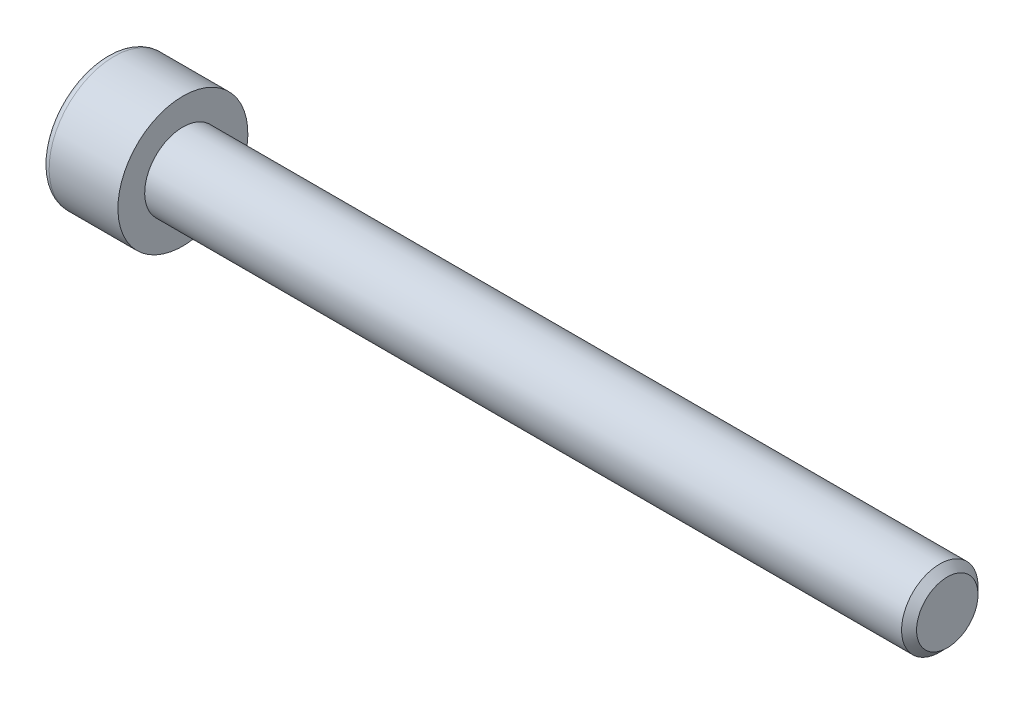
ISO-10303-21;
HEADER;
FILE_DESCRIPTION(('STEP AP214'),'2;1');
FILE_NAME('part.step','',(''),(''),'','','');
FILE_SCHEMA(('AUTOMOTIVE_DESIGN { 1 0 10303 214 1 1 1 1 }'));
ENDSEC;
DATA;
#1=APPLICATION_CONTEXT('core data for automotive mechanical design processes');
#2=APPLICATION_PROTOCOL_DEFINITION('international standard','automotive_design',2000,#1);
#3=PRODUCT_CONTEXT('',#1,'mechanical');
#4=PRODUCT('Part','Part','',(#3));
#5=PRODUCT_RELATED_PRODUCT_CATEGORY('part','',(#4));
#6=PRODUCT_DEFINITION_FORMATION('','',#4);
#7=PRODUCT_DEFINITION_CONTEXT('part definition',#1,'design');
#8=PRODUCT_DEFINITION('design','',#6,#7);
#9=PRODUCT_DEFINITION_SHAPE('','',#8);
#10=(LENGTH_UNIT() NAMED_UNIT(*) SI_UNIT(.MILLI.,.METRE.));
#11=(NAMED_UNIT(*) PLANE_ANGLE_UNIT() SI_UNIT($,.RADIAN.));
#12=(NAMED_UNIT(*) SI_UNIT($,.STERADIAN.) SOLID_ANGLE_UNIT());
#13=UNCERTAINTY_MEASURE_WITH_UNIT(LENGTH_MEASURE(1.E-05),#10,'distance_accuracy_value','');
#14=(GEOMETRIC_REPRESENTATION_CONTEXT(3) GLOBAL_UNCERTAINTY_ASSIGNED_CONTEXT((#13)) GLOBAL_UNIT_ASSIGNED_CONTEXT((#10,
#11,#12)) REPRESENTATION_CONTEXT('',''));
#15=CARTESIAN_POINT('',(0.,0.,0.));
#16=DIRECTION('',(0.,0.,1.));
#17=DIRECTION('',(1.,0.,0.));
#18=AXIS2_PLACEMENT_3D('',#15,#16,#17);
#19=CARTESIAN_POINT('',(-1.16666666667697,0.,0.));
#20=DIRECTION('',(-1.,0.,0.));
#21=DIRECTION('',(0.,0.,1.));
#22=AXIS2_PLACEMENT_3D('',#19,#20,#21);
#23=CONICAL_SURFACE('',#22,0.,1.04719755119019);
#24=CARTESIAN_POINT('',(-1.16666666667697,0.,0.));
#25=VERTEX_POINT('',#24);
#26=VERTEX_LOOP('',#25);
#27=FACE_BOUND('',#26,.T.);
#28=CARTESIAN_POINT('',(-2.50000000002772,-6.92690109786421E-12,-2.30940107675451));
#29=CARTESIAN_POINT('',(-2.47069554515409,-0.0878878875699675,-2.25865898121148));
#30=CARTESIAN_POINT('',(-2.44404467712742,-0.176534422128159,-2.20747888062158));
#31=CARTESIAN_POINT('',(-2.39752638742714,-0.355362346693125,-2.10423253023537));
#32=CARTESIAN_POINT('',(-2.37767542036486,-0.445546913091718,-2.05216444654839));
#33=CARTESIAN_POINT('',(-2.34677595897283,-0.624798433766054,-1.94867353283442));
#34=CARTESIAN_POINT('',(-2.33552178762371,-0.713837815623628,-1.89726662175047));
#35=CARTESIAN_POINT('',(-2.32208916815753,-0.892335320469239,-1.79421103927818));
#36=CARTESIAN_POINT('',(-2.3198995940015,-0.981792795112552,-1.74256274221184));
#37=CARTESIAN_POINT('',(-2.32446629018259,-1.14893448971583,-1.64606343983982));
#38=CARTESIAN_POINT('',(-2.33010128524422,-1.22664379064875,-1.60119795402767));
#39=CARTESIAN_POINT('',(-2.34795730074633,-1.38155614176728,-1.51175926640858));
#40=CARTESIAN_POINT('',(-2.36018441479689,-1.45875865655235,-1.46718637371531));
#41=CARTESIAN_POINT('',(-2.39074983336655,-1.61399014172354,-1.37756343396501));
#42=CARTESIAN_POINT('',(-2.40921764224648,-1.69199947538136,-1.33252472417837));
#43=CARTESIAN_POINT('',(-2.45113176086735,-1.84685497000033,-1.24311886267461));
#44=CARTESIAN_POINT('',(-2.47456822878008,-1.92370311330898,-1.19875056644864));
#45=CARTESIAN_POINT('',(-2.50000000002772,-1.99999999999307,-1.15470053838325));
#46=B_SPLINE_CURVE_WITH_KNOTS('',3,(#28,#29,#30,#31,#32,#33,#34,#35,#36,#37,#38,#39,#40,#41,#42,
#43,#44,#45),.UNSPECIFIED.,.F.,.F.,(4,2,2,2,2,2,2,2,4),(0.,0.317016011557088,0.634793817027589,
0.944707606153461,1.25424088889841,1.52370778262845,1.79342419378692,2.06912162247711,
2.34427797349934),.UNSPECIFIED.);
#47=CARTESIAN_POINT('',(-2.50000000002772,0.,-2.30940107675451));
#48=VERTEX_POINT('',#47);
#49=CARTESIAN_POINT('',(-2.50000000002772,-1.99999999999654,-1.15470053837725));
#50=VERTEX_POINT('',#49);
#51=EDGE_CURVE('E138',#48,#50,#46,.T.);
#52=ORIENTED_EDGE('',*,*,#51,.T.);
#53=CARTESIAN_POINT('',(-2.50000000002772,-2.,-1.15470053837125));
#54=CARTESIAN_POINT('',(-2.47263377290747,-2.,-1.05991107418636));
#55=CARTESIAN_POINT('',(-2.44757921995705,-2.,-0.964371741189674));
#56=CARTESIAN_POINT('',(-2.40329840636778,-2.,-0.771741104892955));
#57=CARTESIAN_POINT('',(-2.38408518617665,-2.,-0.674646831223166));
#58=CARTESIAN_POINT('',(-2.35318800206326,-2.,-0.481547768443135));
#59=CARTESIAN_POINT('',(-2.34133930729348,-2.,-0.385570166139693));
#60=CARTESIAN_POINT('',(-2.32543313734544,-2.,-0.193061232217813));
#61=CARTESIAN_POINT('',(-2.32136720507473,-2.,-0.0965306161072731));
#62=CARTESIAN_POINT('',(-2.32136720507188,-2.,0.0965306087795346));
#63=CARTESIAN_POINT('',(-2.32543313672243,-2.,0.193061217555803));
#64=CARTESIAN_POINT('',(-2.34133930429026,-2.,0.385570136931378));
#65=CARTESIAN_POINT('',(-2.35318799729708,-2.,0.481547732023092));
#66=CARTESIAN_POINT('',(-2.38408517693299,-2.,0.674646780255356));
#67=CARTESIAN_POINT('',(-2.40329839437538,-2.,0.771741046596714));
#68=CARTESIAN_POINT('',(-2.44757920184622,-2.,0.964371668527462));
#69=CARTESIAN_POINT('',(-2.47263375143113,-2.,1.05991099448547));
#70=CARTESIAN_POINT('',(-2.4999999750194,-2.,1.15470045173988));
#71=B_SPLINE_CURVE_WITH_KNOTS('',3,(#53,#54,#55,#56,#57,#58,#59,#60,#61,#62,#63,#64,#65,#66,#67,
#68,#69,#70),.UNSPECIFIED.,.F.,.F.,(4,2,2,2,2,2,2,2,4),(0.,0.296073395837264,0.592802985914095,
0.882630859073849,1.17214361331652,1.46165634558198,1.75148419667861,2.04821376361903,
2.34428713651065),.UNSPECIFIED.);
#72=CARTESIAN_POINT('',(-2.49999999233435,-2.00000001442891,1.15470048672903));
#73=VERTEX_POINT('',#72);
#74=EDGE_CURVE('E320',#50,#73,#71,.T.);
#75=ORIENTED_EDGE('',*,*,#74,.T.);
#76=CARTESIAN_POINT('',(-2.50000003231498,-2.00000000443896,1.15470049250949));
#77=CARTESIAN_POINT('',(-2.47069556141285,-1.91211212986852,1.20544260830426));
#78=CARTESIAN_POINT('',(-2.4440446860581,-1.82346559924677,1.25662271800665));
#79=CARTESIAN_POINT('',(-2.39752638961972,-1.64463767471672,1.35986907672013));
#80=CARTESIAN_POINT('',(-2.3776754231514,-1.55445310440017,1.41193715959666));
#81=CARTESIAN_POINT('',(-2.34677596129522,-1.37520157840778,1.51542807419591));
#82=CARTESIAN_POINT('',(-2.33552178889736,-1.28616219510353,1.56683498690637));
#83=CARTESIAN_POINT('',(-2.32208916823046,-1.10766468668214,1.66989057201796));
#84=CARTESIAN_POINT('',(-2.31989959392978,-1.01820720990997,1.72153887009819));
#85=CARTESIAN_POINT('',(-2.32446629004929,-0.851065513068019,1.81803817362797));
#86=CARTESIAN_POINT('',(-2.33010128501756,-0.773356212002576,1.86290365956245));
#87=CARTESIAN_POINT('',(-2.34795730039037,-0.61844386063507,1.95234234735909));
#88=CARTESIAN_POINT('',(-2.36018441440079,-0.541241345733143,1.9969152401078));
#89=CARTESIAN_POINT('',(-2.39074983295,-0.386009860111517,2.08653818010828));
#90=CARTESIAN_POINT('',(-2.40921764186712,-0.308000526122906,2.13157689008841));
#91=CARTESIAN_POINT('',(-2.4511317606282,-0.153145030780701,2.2209827520147));
#92=CARTESIAN_POINT('',(-2.47456822864842,-0.076296887080505,2.26535104846921));
#93=CARTESIAN_POINT('',(-2.50000000002772,-6.92562731338522E-12,2.3094010767545));
#94=B_SPLINE_CURVE_WITH_KNOTS('',3,(#76,#77,#78,#79,#80,#81,#82,#83,#84,#85,#86,#87,#88,#89,#90,
#91,#92,#93),.UNSPECIFIED.,.F.,.F.,(4,2,2,2,2,2,2,2,4),(0.,0.317016020366453,0.634793833974186,
0.944707629768868,1.25424091946273,1.5237078137243,1.79342422524043,2.06912165507871,
2.34427800749697),.UNSPECIFIED.);
#95=CARTESIAN_POINT('',(-2.50000000002772,0.,2.3094010767545));
#96=VERTEX_POINT('',#95);
#97=EDGE_CURVE('E336',#73,#96,#94,.T.);
#98=ORIENTED_EDGE('',*,*,#97,.T.);
#99=CARTESIAN_POINT('',(-2.50000000002772,6.92566095216022E-12,2.3094010767545));
#100=CARTESIAN_POINT('',(-2.47069554515409,0.0878878875699661,2.25865898121148));
#101=CARTESIAN_POINT('',(-2.44404467712742,0.176534422128157,2.20747888062158));
#102=CARTESIAN_POINT('',(-2.39752638742714,0.355362346693123,2.10423253023537));
#103=CARTESIAN_POINT('',(-2.37767542036486,0.445546913091717,2.05216444654839));
#104=CARTESIAN_POINT('',(-2.34677595897283,0.624798433766052,1.94867353283442));
#105=CARTESIAN_POINT('',(-2.33552178762371,0.713837815623626,1.89726662175047));
#106=CARTESIAN_POINT('',(-2.32208916815753,0.892335320469238,1.79421103927818));
#107=CARTESIAN_POINT('',(-2.3198995940015,0.98179279511255,1.74256274221184));
#108=CARTESIAN_POINT('',(-2.32446629018259,1.14893448971583,1.64606343983982));
#109=CARTESIAN_POINT('',(-2.33010128524422,1.22664379064875,1.60119795402767));
#110=CARTESIAN_POINT('',(-2.34795730074633,1.38155614176728,1.51175926640858));
#111=CARTESIAN_POINT('',(-2.36018441479689,1.45875865655235,1.46718637371531));
#112=CARTESIAN_POINT('',(-2.39074983336655,1.61399014172354,1.37756343396501));
#113=CARTESIAN_POINT('',(-2.40921764224648,1.69199947538136,1.33252472417837));
#114=CARTESIAN_POINT('',(-2.45113176086735,1.84685497000033,1.24311886267461));
#115=CARTESIAN_POINT('',(-2.47456822878008,1.92370311330899,1.19875056644864));
#116=CARTESIAN_POINT('',(-2.50000000002772,1.99999999999308,1.15470053838325));
#117=B_SPLINE_CURVE_WITH_KNOTS('',3,(#99,#100,#101,#102,#103,#104,#105,#106,#107,#108,#109,#110,
#111,#112,#113,#114,#115,#116),.UNSPECIFIED.,.F.,.F.,(4,2,2,2,2,2,2,2,4),(0.,0.317016011557087,
0.634793817027588,0.94470760615346,1.25424088889841,1.52370778262845,1.79342419378692,
2.06912162247711,2.34427797349934),.UNSPECIFIED.);
#118=CARTESIAN_POINT('',(-2.50000000002772,1.99999999999654,1.15470053837725));
#119=VERTEX_POINT('',#118);
#120=EDGE_CURVE('E341',#96,#119,#117,.T.);
#121=ORIENTED_EDGE('',*,*,#120,.T.);
#122=CARTESIAN_POINT('',(-2.50000000002772,2.,1.15470053837125));
#123=CARTESIAN_POINT('',(-2.47263377290036,2.,1.05991107416127));
#124=CARTESIAN_POINT('',(-2.44757921994389,2.,0.964371741139248));
#125=CARTESIAN_POINT('',(-2.40329840634492,2.,0.771741104786663));
#126=CARTESIAN_POINT('',(-2.38408518615041,2.,0.674646831086282));
#127=CARTESIAN_POINT('',(-2.35318800204471,2.,0.481547768300791));
#128=CARTESIAN_POINT('',(-2.34133930728186,2.,0.385570166023165));
#129=CARTESIAN_POINT('',(-2.32543313734251,2.,0.193061232158415));
#130=CARTESIAN_POINT('',(-2.32136720507331,2.,0.0965306160792071));
#131=CARTESIAN_POINT('',(-2.32136720507331,2.,-0.0965306160792082));
#132=CARTESIAN_POINT('',(-2.32543313734251,2.,-0.193061232158416));
#133=CARTESIAN_POINT('',(-2.34133930728186,2.,-0.385570166023167));
#134=CARTESIAN_POINT('',(-2.35318800204471,2.,-0.481547768300793));
#135=CARTESIAN_POINT('',(-2.38408518615041,2.,-0.674646831086284));
#136=CARTESIAN_POINT('',(-2.40329840634492,2.,-0.771741104786666));
#137=CARTESIAN_POINT('',(-2.44757921994389,2.,-0.964371741139251));
#138=CARTESIAN_POINT('',(-2.47263377290036,2.,-1.05991107416128));
#139=CARTESIAN_POINT('',(-2.50000000002772,2.,-1.15470053837126));
#140=B_SPLINE_CURVE_WITH_KNOTS('',3,(#122,#123,#124,#125,#126,#127,#128,#129,#130,#131,#132,
#133,#134,#135,#136,#137,#138,#139),.UNSPECIFIED.,.F.,.F.,(4,2,2,2,2,2,2,2,4),(0.,
0.296073395915318,0.592802986084094,0.882630859163671,1.17214361331655,1.46165636746943,
1.75148424054901,2.04821383071779,2.3442872266331),.UNSPECIFIED.);
#141=CARTESIAN_POINT('',(-2.50000000002888,2.,-1.15470053837525));
#142=VERTEX_POINT('',#141);
#143=EDGE_CURVE('E21',#119,#142,#140,.T.);
#144=ORIENTED_EDGE('',*,*,#143,.T.);
#145=CARTESIAN_POINT('',(-2.50000000002772,1.99999999999307,-1.15470053838325));
#146=CARTESIAN_POINT('',(-2.47069554515409,1.91211211243003,-1.20544263392628));
#147=CARTESIAN_POINT('',(-2.44404467712742,1.82346557787184,-1.25662273451618));
#148=CARTESIAN_POINT('',(-2.39752638742714,1.64463765330688,-1.35986908490239));
#149=CARTESIAN_POINT('',(-2.37767542036486,1.55445308690828,-1.41193716858936));
#150=CARTESIAN_POINT('',(-2.34677595897283,1.37520156623395,-1.51542808230334));
#151=CARTESIAN_POINT('',(-2.33552178762371,1.28616218437637,-1.56683499338729));
#152=CARTESIAN_POINT('',(-2.32208916815753,1.10766467953076,-1.66989057585958));
#153=CARTESIAN_POINT('',(-2.3198995940015,1.01820720488745,-1.72153887292592));
#154=CARTESIAN_POINT('',(-2.32446629018259,0.851065510284168,-1.81803817529793));
#155=CARTESIAN_POINT('',(-2.33010128524422,0.773356209351252,-1.86290366111009));
#156=CARTESIAN_POINT('',(-2.34795730074633,0.618443858232721,-1.95234234872917));
#157=CARTESIAN_POINT('',(-2.36018441479689,0.541241343447649,-1.99691524142245));
#158=CARTESIAN_POINT('',(-2.39074983336655,0.386009858276457,-2.08653818117274));
#159=CARTESIAN_POINT('',(-2.40921764224648,0.308000524618637,-2.13157689095939));
#160=CARTESIAN_POINT('',(-2.45113176086735,0.153145029999667,-2.22098275246314));
#161=CARTESIAN_POINT('',(-2.47456822878008,0.0762968866910162,-2.26535104868912));
#162=CARTESIAN_POINT('',(-2.50000000002772,6.92553144990538E-12,-2.30940107675451));
#163=B_SPLINE_CURVE_WITH_KNOTS('',3,(#145,#146,#147,#148,#149,#150,#151,#152,#153,#154,#155,
#156,#157,#158,#159,#160,#161,#162),.UNSPECIFIED.,.F.,.F.,(4,2,2,2,2,2,2,2,4),(0.,
0.317016011557087,0.634793817027589,0.94470760615346,1.25424088889841,1.52370778262845,
1.79342419378692,2.06912162247711,2.34427797349934),.UNSPECIFIED.);
#164=EDGE_CURVE('E91',#142,#48,#163,.T.);
#165=ORIENTED_EDGE('',*,*,#164,.T.);
#166=EDGE_LOOP('',(#52,#75,#98,#121,#144,#165));
#167=FACE_BOUND('',#166,.T.);
#168=ADVANCED_FACE('F17',(#27,#167),#23,.F.);
#169=CARTESIAN_POINT('',(-5.,2.,1.15470053837925));
#170=DIRECTION('',(0.,1.,0.));
#171=DIRECTION('',(0.,0.,1.));
#172=AXIS2_PLACEMENT_3D('',#169,#170,#171);
#173=PLANE('',#172);
#174=DIRECTION('',(1.,0.,0.));
#175=VECTOR('',#174,1.);
#176=CARTESIAN_POINT('',(-5.,2.,1.15470053837925));
#177=LINE('',#176,#175);
#178=CARTESIAN_POINT('',(-5.,2.,1.15470053837925));
#179=VERTEX_POINT('',#178);
#180=EDGE_CURVE('E85',#119,#179,#177,.F.);
#181=ORIENTED_EDGE('',*,*,#180,.T.);
#182=DIRECTION('',(0.,0.,1.));
#183=VECTOR('',#182,1.);
#184=CARTESIAN_POINT('',(-5.,2.,0.));
#185=LINE('',#184,#183);
#186=CARTESIAN_POINT('',(-5.,2.,-1.15470053837925));
#187=VERTEX_POINT('',#186);
#188=EDGE_CURVE('E79',#187,#179,#185,.T.);
#189=ORIENTED_EDGE('',*,*,#188,.F.);
#190=DIRECTION('',(1.,0.,0.));
#191=VECTOR('',#190,1.);
#192=CARTESIAN_POINT('',(-5.,2.,-1.15470053837925));
#193=LINE('',#192,#191);
#194=EDGE_CURVE('E82',#187,#142,#193,.T.);
#195=ORIENTED_EDGE('',*,*,#194,.T.);
#196=ORIENTED_EDGE('',*,*,#143,.F.);
#197=EDGE_LOOP('',(#181,#189,#195,#196));
#198=FACE_BOUND('',#197,.T.);
#199=ADVANCED_FACE('F81',(#198),#173,.F.);
#200=CARTESIAN_POINT('',(-5.,0.,2.3094010767585));
#201=DIRECTION('',(0.,0.5,0.866025403784438));
#202=DIRECTION('',(0.,-0.866025403784438,0.5));
#203=AXIS2_PLACEMENT_3D('',#200,#201,#202);
#204=PLANE('',#203);
#205=DIRECTION('',(1.,0.,0.));
#206=VECTOR('',#205,1.);
#207=CARTESIAN_POINT('',(-5.,0.,2.3094010767585));
#208=LINE('',#207,#206);
#209=CARTESIAN_POINT('',(-5.,0.,2.3094010767585));
#210=VERTEX_POINT('',#209);
#211=EDGE_CURVE('E339',#96,#210,#208,.F.);
#212=ORIENTED_EDGE('',*,*,#211,.T.);
#213=DIRECTION('',(0.,-0.866025403784438,0.5));
#214=VECTOR('',#213,1.);
#215=CARTESIAN_POINT('',(-5.,2.,1.15470053837925));
#216=LINE('',#215,#214);
#217=EDGE_CURVE('E90',#179,#210,#216,.T.);
#218=ORIENTED_EDGE('',*,*,#217,.F.);
#219=ORIENTED_EDGE('',*,*,#180,.F.);
#220=ORIENTED_EDGE('',*,*,#120,.F.);
#221=EDGE_LOOP('',(#212,#218,#219,#220));
#222=FACE_BOUND('',#221,.T.);
#223=ADVANCED_FACE('F284',(#222),#204,.F.);
#224=CARTESIAN_POINT('',(-5.,-2.,1.15470053837925));
#225=DIRECTION('',(0.,-0.5,0.866025403784439));
#226=DIRECTION('',(0.,-0.866025403784439,-0.5));
#227=AXIS2_PLACEMENT_3D('',#224,#225,#226);
#228=PLANE('',#227);
#229=DIRECTION('',(1.,0.,0.));
#230=VECTOR('',#229,1.);
#231=CARTESIAN_POINT('',(-5.,-2.,1.15470053837925));
#232=LINE('',#231,#230);
#233=CARTESIAN_POINT('',(-5.,-2.,1.15470053837925));
#234=VERTEX_POINT('',#233);
#235=EDGE_CURVE('E325',#73,#234,#232,.F.);
#236=ORIENTED_EDGE('',*,*,#235,.T.);
#237=DIRECTION('',(0.,-0.866025403784439,-0.5));
#238=VECTOR('',#237,1.);
#239=CARTESIAN_POINT('',(-5.,0.,2.3094010767585));
#240=LINE('',#239,#238);
#241=EDGE_CURVE('E115',#210,#234,#240,.T.);
#242=ORIENTED_EDGE('',*,*,#241,.F.);
#243=ORIENTED_EDGE('',*,*,#211,.F.);
#244=ORIENTED_EDGE('',*,*,#97,.F.);
#245=EDGE_LOOP('',(#236,#242,#243,#244));
#246=FACE_BOUND('',#245,.T.);
#247=ADVANCED_FACE('F276',(#246),#228,.F.);
#248=CARTESIAN_POINT('',(-5.,-2.,-1.15470053837925));
#249=DIRECTION('',(0.,-1.,0.));
#250=DIRECTION('',(0.,0.,-1.));
#251=AXIS2_PLACEMENT_3D('',#248,#249,#250);
#252=PLANE('',#251);
#253=DIRECTION('',(1.,0.,0.));
#254=VECTOR('',#253,1.);
#255=CARTESIAN_POINT('',(-5.,-2.,-1.15470053837925));
#256=LINE('',#255,#254);
#257=CARTESIAN_POINT('',(-5.,-2.,-1.15470053837925));
#258=VERTEX_POINT('',#257);
#259=EDGE_CURVE('E322',#50,#258,#256,.F.);
#260=ORIENTED_EDGE('',*,*,#259,.T.);
#261=DIRECTION('',(0.,0.,1.));
#262=VECTOR('',#261,1.);
#263=CARTESIAN_POINT('',(-5.,-2.,0.));
#264=LINE('',#263,#262);
#265=EDGE_CURVE('E105',#234,#258,#264,.F.);
#266=ORIENTED_EDGE('',*,*,#265,.F.);
#267=ORIENTED_EDGE('',*,*,#235,.F.);
#268=ORIENTED_EDGE('',*,*,#74,.F.);
#269=EDGE_LOOP('',(#260,#266,#267,#268));
#270=FACE_BOUND('',#269,.T.);
#271=ADVANCED_FACE('F269',(#270),#252,.F.);
#272=CARTESIAN_POINT('',(-5.,0.,-2.3094010767585));
#273=DIRECTION('',(0.,-0.5,-0.866025403784438));
#274=DIRECTION('',(0.,0.866025403784438,-0.5));
#275=AXIS2_PLACEMENT_3D('',#272,#273,#274);
#276=PLANE('',#275);
#277=DIRECTION('',(1.,0.,0.));
#278=VECTOR('',#277,1.);
#279=CARTESIAN_POINT('',(-5.,0.,-2.3094010767585));
#280=LINE('',#279,#278);
#281=CARTESIAN_POINT('',(-5.,0.,-2.3094010767585));
#282=VERTEX_POINT('',#281);
#283=EDGE_CURVE('E41',#48,#282,#280,.F.);
#284=ORIENTED_EDGE('',*,*,#283,.T.);
#285=DIRECTION('',(0.,0.866025403784438,-0.500000000000001));
#286=VECTOR('',#285,1.);
#287=CARTESIAN_POINT('',(-5.,-2.,-1.15470053837925));
#288=LINE('',#287,#286);
#289=EDGE_CURVE('E100',#258,#282,#288,.T.);
#290=ORIENTED_EDGE('',*,*,#289,.F.);
#291=ORIENTED_EDGE('',*,*,#259,.F.);
#292=ORIENTED_EDGE('',*,*,#51,.F.);
#293=EDGE_LOOP('',(#284,#290,#291,#292));
#294=FACE_BOUND('',#293,.T.);
#295=ADVANCED_FACE('F148',(#294),#276,.F.);
#296=CARTESIAN_POINT('',(-5.,2.,-1.15470053837925));
#297=DIRECTION('',(0.,0.5,-0.866025403784439));
#298=DIRECTION('',(0.,0.866025403784439,0.5));
#299=AXIS2_PLACEMENT_3D('',#296,#297,#298);
#300=PLANE('',#299);
#301=ORIENTED_EDGE('',*,*,#194,.F.);
#302=DIRECTION('',(0.,0.866025403784439,0.5));
#303=VECTOR('',#302,1.);
#304=CARTESIAN_POINT('',(-5.,0.,-2.3094010767585));
#305=LINE('',#304,#303);
#306=EDGE_CURVE('E95',#282,#187,#305,.T.);
#307=ORIENTED_EDGE('',*,*,#306,.F.);
#308=ORIENTED_EDGE('',*,*,#283,.F.);
#309=ORIENTED_EDGE('',*,*,#164,.F.);
#310=EDGE_LOOP('',(#301,#307,#308,#309));
#311=FACE_BOUND('',#310,.T.);
#312=ADVANCED_FACE('F94',(#311),#300,.F.);
#313=CARTESIAN_POINT('',(-5.,3.27970053837925,0.));
#314=DIRECTION('',(-1.,0.,0.));
#315=DIRECTION('',(0.,-1.,0.));
#316=AXIS2_PLACEMENT_3D('',#313,#314,#315);
#317=PLANE('',#316);
#318=CARTESIAN_POINT('',(-5.,0.,0.));
#319=DIRECTION('',(1.,0.,0.));
#320=DIRECTION('',(0.,1.,0.));
#321=AXIS2_PLACEMENT_3D('',#318,#319,#320);
#322=CIRCLE('',#321,3.75);
#323=CARTESIAN_POINT('',(-5.,3.75,0.));
#324=VERTEX_POINT('',#323);
#325=EDGE_CURVE('E101',#324,#324,#322,.T.);
#326=ORIENTED_EDGE('',*,*,#325,.F.);
#327=EDGE_LOOP('',(#326));
#328=FACE_BOUND('',#327,.T.);
#329=ORIENTED_EDGE('',*,*,#289,.T.);
#330=ORIENTED_EDGE('',*,*,#306,.T.);
#331=ORIENTED_EDGE('',*,*,#188,.T.);
#332=ORIENTED_EDGE('',*,*,#217,.T.);
#333=ORIENTED_EDGE('',*,*,#241,.T.);
#334=ORIENTED_EDGE('',*,*,#265,.T.);
#335=EDGE_LOOP('',(#329,#330,#331,#332,#333,#334));
#336=FACE_BOUND('',#335,.T.);
#337=ADVANCED_FACE('F98',(#328,#336),#317,.T.);
#338=CARTESIAN_POINT('',(-4.5,0.,0.));
#339=DIRECTION('',(1.,0.,0.));
#340=DIRECTION('',(0.,0.,-1.));
#341=AXIS2_PLACEMENT_3D('',#338,#339,#340);
#342=TOROIDAL_SURFACE('',#341,3.75,0.5);
#343=CARTESIAN_POINT('',(-4.5,0.,0.));
#344=DIRECTION('',(1.,0.,0.));
#345=DIRECTION('',(0.,1.,0.));
#346=AXIS2_PLACEMENT_3D('',#343,#344,#345);
#347=CIRCLE('',#346,4.25);
#348=CARTESIAN_POINT('',(-4.5,4.25,0.));
#349=VERTEX_POINT('',#348);
#350=EDGE_CURVE('E104',#349,#349,#347,.T.);
#351=ORIENTED_EDGE('',*,*,#350,.F.);
#352=EDGE_LOOP('',(#351));
#353=FACE_BOUND('',#352,.T.);
#354=ORIENTED_EDGE('',*,*,#325,.T.);
#355=EDGE_LOOP('',(#354));
#356=FACE_BOUND('',#355,.T.);
#357=ADVANCED_FACE('F154',(#353,#356),#342,.T.);
#358=CARTESIAN_POINT('',(-2.5,0.,0.));
#359=DIRECTION('',(1.,0.,0.));
#360=DIRECTION('',(0.,1.,0.));
#361=AXIS2_PLACEMENT_3D('',#358,#359,#360);
#362=CYLINDRICAL_SURFACE('',#361,4.25);
#363=CARTESIAN_POINT('',(0.,0.,0.));
#364=DIRECTION('',(1.,0.,0.));
#365=DIRECTION('',(0.,1.,0.));
#366=AXIS2_PLACEMENT_3D('',#363,#364,#365);
#367=CIRCLE('',#366,4.25);
#368=CARTESIAN_POINT('',(0.,4.25,0.));
#369=VERTEX_POINT('',#368);
#370=EDGE_CURVE('E130',#369,#369,#367,.T.);
#371=ORIENTED_EDGE('',*,*,#370,.F.);
#372=EDGE_LOOP('',(#371));
#373=FACE_BOUND('',#372,.T.);
#374=ORIENTED_EDGE('',*,*,#350,.T.);
#375=EDGE_LOOP('',(#374));
#376=FACE_BOUND('',#375,.T.);
#377=ADVANCED_FACE('F184',(#373,#376),#362,.T.);
#378=CARTESIAN_POINT('',(50.,1.25,0.));
#379=DIRECTION('',(1.,0.,0.));
#380=DIRECTION('',(0.,0.,-1.));
#381=AXIS2_PLACEMENT_3D('',#378,#379,#380);
#382=PLANE('',#381);
#383=CARTESIAN_POINT('',(49.9999999999682,0.,0.));
#384=DIRECTION('',(-1.,0.,0.));
#385=DIRECTION('',(0.,0.,1.));
#386=AXIS2_PLACEMENT_3D('',#383,#384,#385);
#387=CIRCLE('',#386,2.00923999999303);
#388=CARTESIAN_POINT('',(49.9999999999682,0.,2.00923999999303));
#389=VERTEX_POINT('',#388);
#390=EDGE_CURVE('E127',#389,#389,#387,.T.);
#391=ORIENTED_EDGE('',*,*,#390,.F.);
#392=EDGE_LOOP('',(#391));
#393=FACE_BOUND('',#392,.T.);
#394=ADVANCED_FACE('F190',(#393),#382,.T.);
#395=CARTESIAN_POINT('',(0.,3.375,0.));
#396=DIRECTION('',(1.,0.,0.));
#397=DIRECTION('',(0.,0.,-1.));
#398=AXIS2_PLACEMENT_3D('',#395,#396,#397);
#399=PLANE('',#398);
#400=ORIENTED_EDGE('',*,*,#370,.T.);
#401=EDGE_LOOP('',(#400));
#402=FACE_BOUND('',#401,.T.);
#403=CARTESIAN_POINT('',(0.,0.,0.));
#404=DIRECTION('',(1.,0.,0.));
#405=DIRECTION('',(0.,1.,0.));
#406=AXIS2_PLACEMENT_3D('',#403,#404,#405);
#407=CIRCLE('',#406,2.5);
#408=CARTESIAN_POINT('',(0.,2.5,0.));
#409=VERTEX_POINT('',#408);
#410=EDGE_CURVE('E32',#409,#409,#407,.T.);
#411=ORIENTED_EDGE('',*,*,#410,.F.);
#412=EDGE_LOOP('',(#411));
#413=FACE_BOUND('',#412,.T.);
#414=ADVANCED_FACE('F199',(#402,#413),#399,.T.);
#415=CARTESIAN_POINT('',(49.5092400000203,0.,0.));
#416=DIRECTION('',(-1.,0.,0.));
#417=DIRECTION('',(0.,0.,1.));
#418=AXIS2_PLACEMENT_3D('',#415,#416,#417);
#419=CONICAL_SURFACE('',#418,2.49999999999773,0.785398163455362);
#420=CARTESIAN_POINT('',(49.50924,0.,0.));
#421=DIRECTION('',(1.,0.,0.));
#422=DIRECTION('',(0.,1.,0.));
#423=AXIS2_PLACEMENT_3D('',#420,#421,#422);
#424=CIRCLE('',#423,2.5);
#425=CARTESIAN_POINT('',(49.50924,2.5,0.));
#426=VERTEX_POINT('',#425);
#427=EDGE_CURVE('E11',#426,#426,#424,.F.);
#428=ORIENTED_EDGE('',*,*,#427,.F.);
#429=EDGE_LOOP('',(#428));
#430=FACE_BOUND('',#429,.T.);
#431=ORIENTED_EDGE('',*,*,#390,.T.);
#432=EDGE_LOOP('',(#431));
#433=FACE_BOUND('',#432,.T.);
#434=ADVANCED_FACE('F194',(#430,#433),#419,.T.);
#435=CARTESIAN_POINT('',(39.,0.,0.));
#436=DIRECTION('',(1.,0.,0.));
#437=DIRECTION('',(0.,1.,0.));
#438=AXIS2_PLACEMENT_3D('',#435,#436,#437);
#439=CYLINDRICAL_SURFACE('',#438,2.5);
#440=ORIENTED_EDGE('',*,*,#410,.T.);
#441=EDGE_LOOP('',(#440));
#442=FACE_BOUND('',#441,.T.);
#443=ORIENTED_EDGE('',*,*,#427,.T.);
#444=EDGE_LOOP('',(#443));
#445=FACE_BOUND('',#444,.T.);
#446=ADVANCED_FACE('F19',(#442,#445),#439,.T.);
#447=CLOSED_SHELL('',(#168,#199,#223,#247,#271,#295,#312,#337,#357,#377,#394,#414,#434,#446));
#448=MANIFOLD_SOLID_BREP('B1',#447);
#449=ADVANCED_BREP_SHAPE_REPRESENTATION('',(#18,#448),#14);
#450=SHAPE_DEFINITION_REPRESENTATION(#9,#449);
ENDSEC;
END-ISO-10303-21;
